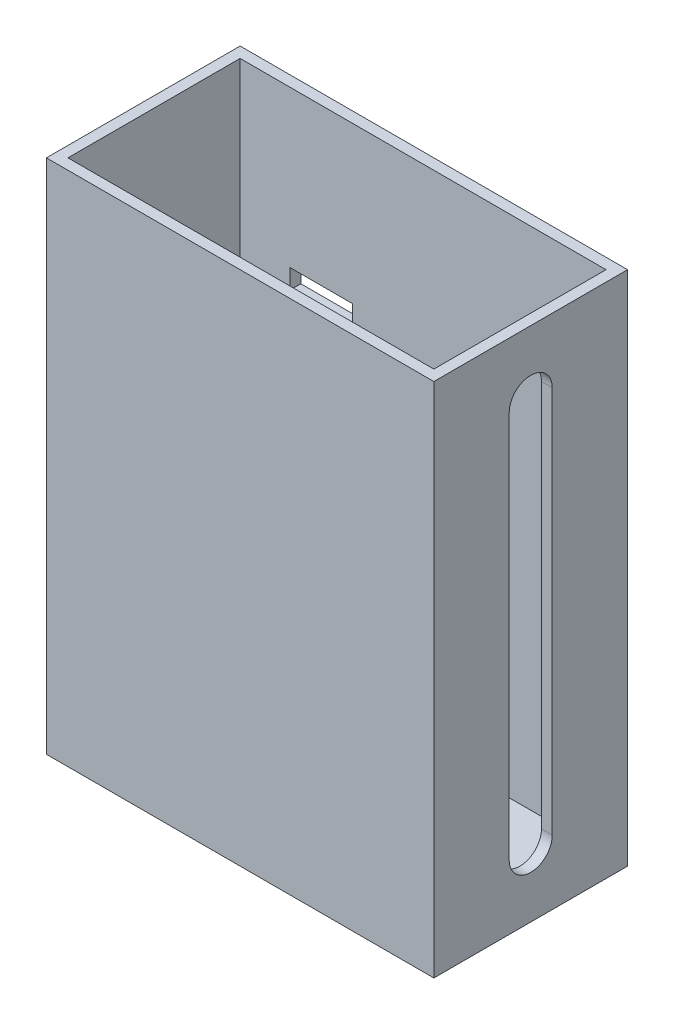
ISO-10303-21;
HEADER;
FILE_DESCRIPTION(('STEP AP214'),'2;1');
FILE_NAME('part.step','',(''),(''),'','','');
FILE_SCHEMA(('AUTOMOTIVE_DESIGN { 1 0 10303 214 1 1 1 1 }'));
ENDSEC;
DATA;
#1=APPLICATION_CONTEXT('core data for automotive mechanical design processes');
#2=APPLICATION_PROTOCOL_DEFINITION('international standard','automotive_design',2000,#1);
#3=PRODUCT_CONTEXT('',#1,'mechanical');
#4=PRODUCT('Part','Part','',(#3));
#5=PRODUCT_RELATED_PRODUCT_CATEGORY('part','',(#4));
#6=PRODUCT_DEFINITION_FORMATION('','',#4);
#7=PRODUCT_DEFINITION_CONTEXT('part definition',#1,'design');
#8=PRODUCT_DEFINITION('design','',#6,#7);
#9=PRODUCT_DEFINITION_SHAPE('','',#8);
#10=(LENGTH_UNIT() NAMED_UNIT(*) SI_UNIT(.MILLI.,.METRE.));
#11=(NAMED_UNIT(*) PLANE_ANGLE_UNIT() SI_UNIT($,.RADIAN.));
#12=(NAMED_UNIT(*) SI_UNIT($,.STERADIAN.) SOLID_ANGLE_UNIT());
#13=UNCERTAINTY_MEASURE_WITH_UNIT(LENGTH_MEASURE(1.E-05),#10,'distance_accuracy_value','');
#14=(GEOMETRIC_REPRESENTATION_CONTEXT(3) GLOBAL_UNCERTAINTY_ASSIGNED_CONTEXT((#13)) GLOBAL_UNIT_ASSIGNED_CONTEXT((#10,
#11,#12)) REPRESENTATION_CONTEXT('',''));
#15=CARTESIAN_POINT('',(0.,0.,0.));
#16=DIRECTION('',(0.,0.,1.));
#17=DIRECTION('',(1.,0.,0.));
#18=AXIS2_PLACEMENT_3D('',#15,#16,#17);
#19=CARTESIAN_POINT('',(228.6,609.6,-114.3));
#20=DIRECTION('',(-1.,0.,0.));
#21=DIRECTION('',(0.,0.,1.));
#22=AXIS2_PLACEMENT_3D('',#19,#20,#21);
#23=PLANE('',#22);
#24=DIRECTION('',(0.,1.,0.));
#25=VECTOR('',#24,1.);
#26=CARTESIAN_POINT('',(228.6,76.2,-25.4));
#27=LINE('',#26,#25);
#28=CARTESIAN_POINT('',(228.6,76.2,-25.4));
#29=VERTEX_POINT('',#28);
#30=CARTESIAN_POINT('',(228.6,533.4,-25.3999999999999));
#31=VERTEX_POINT('',#30);
#32=EDGE_CURVE('E320',#29,#31,#27,.T.);
#33=ORIENTED_EDGE('',*,*,#32,.F.);
#34=CARTESIAN_POINT('',(228.6,76.2,0.));
#35=DIRECTION('',(1.,0.,0.));
#36=DIRECTION('',(0.,0.,-1.));
#37=AXIS2_PLACEMENT_3D('',#34,#35,#36);
#38=CIRCLE('',#37,25.4);
#39=CARTESIAN_POINT('',(228.6,76.2,25.4));
#40=VERTEX_POINT('',#39);
#41=EDGE_CURVE('E323',#40,#29,#38,.T.);
#42=ORIENTED_EDGE('',*,*,#41,.F.);
#43=DIRECTION('',(0.,-1.,0.));
#44=VECTOR('',#43,1.);
#45=CARTESIAN_POINT('',(228.6,76.2,25.4));
#46=LINE('',#45,#44);
#47=CARTESIAN_POINT('',(228.6,533.4,25.4000000000001));
#48=VERTEX_POINT('',#47);
#49=EDGE_CURVE('E313',#48,#40,#46,.T.);
#50=ORIENTED_EDGE('',*,*,#49,.F.);
#51=CARTESIAN_POINT('',(228.6,533.4,0.));
#52=DIRECTION('',(1.,0.,0.));
#53=DIRECTION('',(0.,0.,-1.));
#54=AXIS2_PLACEMENT_3D('',#51,#52,#53);
#55=CIRCLE('',#54,25.4);
#56=EDGE_CURVE('E317',#31,#48,#55,.T.);
#57=ORIENTED_EDGE('',*,*,#56,.F.);
#58=EDGE_LOOP('',(#33,#42,#50,#57));
#59=FACE_BOUND('',#58,.T.);
#60=DIRECTION('',(0.,0.,-1.));
#61=VECTOR('',#60,1.);
#62=CARTESIAN_POINT('',(228.6,0.,-114.3));
#63=LINE('',#62,#61);
#64=CARTESIAN_POINT('',(228.6,0.,114.3));
#65=VERTEX_POINT('',#64);
#66=CARTESIAN_POINT('',(228.6,0.,-114.3));
#67=VERTEX_POINT('',#66);
#68=EDGE_CURVE('E346',#65,#67,#63,.T.);
#69=ORIENTED_EDGE('',*,*,#68,.T.);
#70=DIRECTION('',(0.,-1.,0.));
#71=VECTOR('',#70,1.);
#72=CARTESIAN_POINT('',(228.6,609.6,-114.3));
#73=LINE('',#72,#71);
#74=CARTESIAN_POINT('',(228.6,609.6,-114.3));
#75=VERTEX_POINT('',#74);
#76=EDGE_CURVE('E396',#75,#67,#73,.T.);
#77=ORIENTED_EDGE('',*,*,#76,.F.);
#78=DIRECTION('',(0.,0.,-1.));
#79=VECTOR('',#78,1.);
#80=CARTESIAN_POINT('',(228.6,609.6,-114.3));
#81=LINE('',#80,#79);
#82=CARTESIAN_POINT('',(228.6,609.6,114.3));
#83=VERTEX_POINT('',#82);
#84=EDGE_CURVE('E370',#83,#75,#81,.T.);
#85=ORIENTED_EDGE('',*,*,#84,.F.);
#86=DIRECTION('',(0.,-1.,0.));
#87=VECTOR('',#86,1.);
#88=CARTESIAN_POINT('',(228.6,609.6,114.3));
#89=LINE('',#88,#87);
#90=EDGE_CURVE('E380',#83,#65,#89,.T.);
#91=ORIENTED_EDGE('',*,*,#90,.T.);
#92=EDGE_LOOP('',(#69,#77,#85,#91));
#93=FACE_BOUND('',#92,.T.);
#94=ADVANCED_FACE('F56',(#59,#93),#23,.F.);
#95=CARTESIAN_POINT('',(-228.6,609.6,-114.3));
#96=DIRECTION('',(0.,0.,1.));
#97=DIRECTION('',(1.,0.,0.));
#98=AXIS2_PLACEMENT_3D('',#95,#96,#97);
#99=PLANE('',#98);
#100=DIRECTION('',(-1.,0.,0.));
#101=VECTOR('',#100,1.);
#102=CARTESIAN_POINT('',(0.,300.535372474371,-114.3));
#103=LINE('',#102,#101);
#104=CARTESIAN_POINT('',(-93.5736211502286,300.535372474371,-114.3));
#105=VERTEX_POINT('',#104);
#106=CARTESIAN_POINT('',(-157.073621150229,300.535372474371,-114.3));
#107=VERTEX_POINT('',#106);
#108=EDGE_CURVE('E256',#105,#107,#103,.T.);
#109=ORIENTED_EDGE('',*,*,#108,.F.);
#110=DIRECTION('',(0.,-1.,0.));
#111=VECTOR('',#110,1.);
#112=CARTESIAN_POINT('',(-93.5736211502286,0.,-114.3));
#113=LINE('',#112,#111);
#114=CARTESIAN_POINT('',(-93.5736211502286,369.115372474371,-114.3));
#115=VERTEX_POINT('',#114);
#116=EDGE_CURVE('E260',#115,#105,#113,.T.);
#117=ORIENTED_EDGE('',*,*,#116,.F.);
#118=DIRECTION('',(-1.,0.,0.));
#119=VECTOR('',#118,1.);
#120=CARTESIAN_POINT('',(0.,369.115372474371,-114.3));
#121=LINE('',#120,#119);
#122=CARTESIAN_POINT('',(-157.073621150229,369.115372474371,-114.3));
#123=VERTEX_POINT('',#122);
#124=EDGE_CURVE('E249',#115,#123,#121,.T.);
#125=ORIENTED_EDGE('',*,*,#124,.T.);
#126=DIRECTION('',(0.,-1.,0.));
#127=VECTOR('',#126,1.);
#128=CARTESIAN_POINT('',(-157.073621150229,0.,-114.3));
#129=LINE('',#128,#127);
#130=EDGE_CURVE('E248',#123,#107,#129,.T.);
#131=ORIENTED_EDGE('',*,*,#130,.T.);
#132=EDGE_LOOP('',(#109,#117,#125,#131));
#133=FACE_BOUND('',#132,.T.);
#134=DIRECTION('',(0.,-1.,0.));
#135=VECTOR('',#134,1.);
#136=CARTESIAN_POINT('',(-83.3215847400197,0.,-114.3));
#137=LINE('',#136,#135);
#138=CARTESIAN_POINT('',(-83.3215847400197,425.276963369774,-114.3));
#139=VERTEX_POINT('',#138);
#140=CARTESIAN_POINT('',(-83.3215847400197,402.416963369774,-114.3));
#141=VERTEX_POINT('',#140);
#142=EDGE_CURVE('E297',#139,#141,#137,.T.);
#143=ORIENTED_EDGE('',*,*,#142,.F.);
#144=DIRECTION('',(1.,0.,0.));
#145=VECTOR('',#144,1.);
#146=CARTESIAN_POINT('',(0.,425.276963369774,-114.3));
#147=LINE('',#146,#145);
#148=CARTESIAN_POINT('',(-156.98158474002,425.276963369774,-114.3));
#149=VERTEX_POINT('',#148);
#150=EDGE_CURVE('E282',#149,#139,#147,.T.);
#151=ORIENTED_EDGE('',*,*,#150,.F.);
#152=DIRECTION('',(0.,-1.,0.));
#153=VECTOR('',#152,1.);
#154=CARTESIAN_POINT('',(-156.98158474002,0.,-114.3));
#155=LINE('',#154,#153);
#156=CARTESIAN_POINT('',(-156.98158474002,402.416963369774,-114.3));
#157=VERTEX_POINT('',#156);
#158=EDGE_CURVE('E291',#149,#157,#155,.T.);
#159=ORIENTED_EDGE('',*,*,#158,.T.);
#160=DIRECTION('',(1.,0.,0.));
#161=VECTOR('',#160,1.);
#162=CARTESIAN_POINT('',(0.,402.416963369774,-114.3));
#163=LINE('',#162,#161);
#164=EDGE_CURVE('E294',#157,#141,#163,.T.);
#165=ORIENTED_EDGE('',*,*,#164,.T.);
#166=EDGE_LOOP('',(#143,#151,#159,#165));
#167=FACE_BOUND('',#166,.T.);
#168=DIRECTION('',(-1.,0.,0.));
#169=VECTOR('',#168,1.);
#170=CARTESIAN_POINT('',(-228.6,0.,-114.3));
#171=LINE('',#170,#169);
#172=CARTESIAN_POINT('',(-228.6,0.,-114.3));
#173=VERTEX_POINT('',#172);
#174=EDGE_CURVE('E383',#67,#173,#171,.T.);
#175=ORIENTED_EDGE('',*,*,#174,.T.);
#176=DIRECTION('',(0.,-1.,0.));
#177=VECTOR('',#176,1.);
#178=CARTESIAN_POINT('',(-228.6,609.6,-114.3));
#179=LINE('',#178,#177);
#180=CARTESIAN_POINT('',(-228.6,609.6,-114.3));
#181=VERTEX_POINT('',#180);
#182=EDGE_CURVE('E393',#181,#173,#179,.T.);
#183=ORIENTED_EDGE('',*,*,#182,.F.);
#184=DIRECTION('',(-1.,0.,0.));
#185=VECTOR('',#184,1.);
#186=CARTESIAN_POINT('',(-228.6,609.6,-114.3));
#187=LINE('',#186,#185);
#188=EDGE_CURVE('E373',#75,#181,#187,.T.);
#189=ORIENTED_EDGE('',*,*,#188,.F.);
#190=ORIENTED_EDGE('',*,*,#76,.T.);
#191=EDGE_LOOP('',(#175,#183,#189,#190));
#192=FACE_BOUND('',#191,.T.);
#193=ADVANCED_FACE('F423',(#133,#167,#192),#99,.F.);
#194=CARTESIAN_POINT('',(-228.6,609.6,-114.3));
#195=DIRECTION('',(1.,0.,0.));
#196=DIRECTION('',(0.,0.,-1.));
#197=AXIS2_PLACEMENT_3D('',#194,#195,#196);
#198=PLANE('',#197);
#199=DIRECTION('',(0.,0.,-1.));
#200=VECTOR('',#199,1.);
#201=CARTESIAN_POINT('',(-228.6,30.4659225321989,-65.385211060069));
#202=LINE('',#201,#200);
#203=CARTESIAN_POINT('',(-228.6,30.4659225321989,-65.385211060069));
#204=VERTEX_POINT('',#203);
#205=CARTESIAN_POINT('',(-228.6,30.4659225321989,-88.1132200210403));
#206=VERTEX_POINT('',#205);
#207=EDGE_CURVE('E227',#204,#206,#202,.T.);
#208=ORIENTED_EDGE('',*,*,#207,.F.);
#209=CARTESIAN_POINT('',(-228.6,24.1159225321989,-65.385211060069));
#210=DIRECTION('',(-1.,0.,0.));
#211=DIRECTION('',(0.,0.,1.));
#212=AXIS2_PLACEMENT_3D('',#209,#210,#211);
#213=CIRCLE('',#212,6.35);
#214=CARTESIAN_POINT('',(-228.6,17.7659225321989,-65.385211060069));
#215=VERTEX_POINT('',#214);
#216=EDGE_CURVE('E70',#215,#204,#213,.T.);
#217=ORIENTED_EDGE('',*,*,#216,.F.);
#218=DIRECTION('',(0.,0.,-1.));
#219=VECTOR('',#218,1.);
#220=CARTESIAN_POINT('',(-228.6,17.7659225321989,-65.385211060069));
#221=LINE('',#220,#219);
#222=CARTESIAN_POINT('',(-228.6,17.7659225321989,-88.1132200210403));
#223=VERTEX_POINT('',#222);
#224=EDGE_CURVE('E234',#215,#223,#221,.T.);
#225=ORIENTED_EDGE('',*,*,#224,.T.);
#226=CARTESIAN_POINT('',(-228.6,24.1159225321989,-88.1132200210403));
#227=DIRECTION('',(-1.,0.,0.));
#228=DIRECTION('',(0.,0.,1.));
#229=AXIS2_PLACEMENT_3D('',#226,#227,#228);
#230=CIRCLE('',#229,6.35);
#231=EDGE_CURVE('E218',#206,#223,#230,.T.);
#232=ORIENTED_EDGE('',*,*,#231,.F.);
#233=EDGE_LOOP('',(#208,#217,#225,#232));
#234=FACE_BOUND('',#233,.T.);
#235=DIRECTION('',(0.,0.,1.));
#236=VECTOR('',#235,1.);
#237=CARTESIAN_POINT('',(-228.6,0.,-114.3));
#238=LINE('',#237,#236);
#239=CARTESIAN_POINT('',(-228.6,0.,114.3));
#240=VERTEX_POINT('',#239);
#241=EDGE_CURVE('E385',#173,#240,#238,.T.);
#242=ORIENTED_EDGE('',*,*,#241,.T.);
#243=DIRECTION('',(0.,-1.,0.));
#244=VECTOR('',#243,1.);
#245=CARTESIAN_POINT('',(-228.6,609.6,114.3));
#246=LINE('',#245,#244);
#247=CARTESIAN_POINT('',(-228.6,609.6,114.3));
#248=VERTEX_POINT('',#247);
#249=EDGE_CURVE('E390',#248,#240,#246,.T.);
#250=ORIENTED_EDGE('',*,*,#249,.F.);
#251=DIRECTION('',(0.,0.,1.));
#252=VECTOR('',#251,1.);
#253=CARTESIAN_POINT('',(-228.6,609.6,-114.3));
#254=LINE('',#253,#252);
#255=EDGE_CURVE('E376',#181,#248,#254,.T.);
#256=ORIENTED_EDGE('',*,*,#255,.F.);
#257=ORIENTED_EDGE('',*,*,#182,.T.);
#258=EDGE_LOOP('',(#242,#250,#256,#257));
#259=FACE_BOUND('',#258,.T.);
#260=ADVANCED_FACE('F231',(#234,#259),#198,.F.);
#261=CARTESIAN_POINT('',(-228.6,609.6,114.3));
#262=DIRECTION('',(0.,0.,-1.));
#263=DIRECTION('',(-1.,0.,0.));
#264=AXIS2_PLACEMENT_3D('',#261,#262,#263);
#265=PLANE('',#264);
#266=DIRECTION('',(1.,0.,0.));
#267=VECTOR('',#266,1.);
#268=CARTESIAN_POINT('',(-228.6,0.,114.3));
#269=LINE('',#268,#267);
#270=EDGE_CURVE('E374',#240,#65,#269,.T.);
#271=ORIENTED_EDGE('',*,*,#270,.T.);
#272=ORIENTED_EDGE('',*,*,#90,.F.);
#273=DIRECTION('',(1.,0.,0.));
#274=VECTOR('',#273,1.);
#275=CARTESIAN_POINT('',(-228.6,609.6,114.3));
#276=LINE('',#275,#274);
#277=EDGE_CURVE('E378',#248,#83,#276,.T.);
#278=ORIENTED_EDGE('',*,*,#277,.F.);
#279=ORIENTED_EDGE('',*,*,#249,.T.);
#280=EDGE_LOOP('',(#271,#272,#278,#279));
#281=FACE_BOUND('',#280,.T.);
#282=ADVANCED_FACE('F449',(#281),#265,.F.);
#283=CARTESIAN_POINT('',(0.,609.6,0.));
#284=DIRECTION('',(0.,1.,0.));
#285=DIRECTION('',(0.,0.,1.));
#286=AXIS2_PLACEMENT_3D('',#283,#284,#285);
#287=PLANE('',#286);
#288=DIRECTION('',(0.,0.,-1.));
#289=VECTOR('',#288,1.);
#290=CARTESIAN_POINT('',(215.9,609.6,-114.3));
#291=LINE('',#290,#289);
#292=CARTESIAN_POINT('',(215.9,609.6,101.6));
#293=VERTEX_POINT('',#292);
#294=CARTESIAN_POINT('',(215.9,609.6,-101.6));
#295=VERTEX_POINT('',#294);
#296=EDGE_CURVE('E362',#293,#295,#291,.T.);
#297=ORIENTED_EDGE('',*,*,#296,.F.);
#298=DIRECTION('',(1.,0.,0.));
#299=VECTOR('',#298,1.);
#300=CARTESIAN_POINT('',(-228.6,609.6,101.6));
#301=LINE('',#300,#299);
#302=CARTESIAN_POINT('',(-215.9,609.6,101.6));
#303=VERTEX_POINT('',#302);
#304=EDGE_CURVE('E352',#303,#293,#301,.T.);
#305=ORIENTED_EDGE('',*,*,#304,.F.);
#306=DIRECTION('',(0.,0.,1.));
#307=VECTOR('',#306,1.);
#308=CARTESIAN_POINT('',(-215.9,609.6,-114.3));
#309=LINE('',#308,#307);
#310=CARTESIAN_POINT('',(-215.9,609.6,-101.6));
#311=VERTEX_POINT('',#310);
#312=EDGE_CURVE('E366',#311,#303,#309,.T.);
#313=ORIENTED_EDGE('',*,*,#312,.F.);
#314=DIRECTION('',(-1.,0.,0.));
#315=VECTOR('',#314,1.);
#316=CARTESIAN_POINT('',(-228.6,609.6,-101.6));
#317=LINE('',#316,#315);
#318=EDGE_CURVE('E364',#295,#311,#317,.T.);
#319=ORIENTED_EDGE('',*,*,#318,.F.);
#320=EDGE_LOOP('',(#297,#305,#313,#319));
#321=FACE_BOUND('',#320,.T.);
#322=ORIENTED_EDGE('',*,*,#84,.T.);
#323=ORIENTED_EDGE('',*,*,#188,.T.);
#324=ORIENTED_EDGE('',*,*,#255,.T.);
#325=ORIENTED_EDGE('',*,*,#277,.T.);
#326=EDGE_LOOP('',(#322,#323,#324,#325));
#327=FACE_BOUND('',#326,.T.);
#328=ADVANCED_FACE('F445',(#321,#327),#287,.T.);
#329=CARTESIAN_POINT('',(0.,0.,0.));
#330=DIRECTION('',(0.,1.,0.));
#331=DIRECTION('',(0.,0.,1.));
#332=AXIS2_PLACEMENT_3D('',#329,#330,#331);
#333=PLANE('',#332);
#334=ORIENTED_EDGE('',*,*,#68,.F.);
#335=ORIENTED_EDGE('',*,*,#270,.F.);
#336=ORIENTED_EDGE('',*,*,#241,.F.);
#337=ORIENTED_EDGE('',*,*,#174,.F.);
#338=EDGE_LOOP('',(#334,#335,#336,#337));
#339=FACE_BOUND('',#338,.T.);
#340=ADVANCED_FACE('F439',(#339),#333,.F.);
#341=CARTESIAN_POINT('',(215.9,609.6,-114.3));
#342=DIRECTION('',(-1.,0.,0.));
#343=DIRECTION('',(0.,0.,1.));
#344=AXIS2_PLACEMENT_3D('',#341,#342,#343);
#345=PLANE('',#344);
#346=CARTESIAN_POINT('',(215.9,76.2,0.));
#347=DIRECTION('',(-1.,0.,0.));
#348=DIRECTION('',(0.,0.,1.));
#349=AXIS2_PLACEMENT_3D('',#346,#347,#348);
#350=CIRCLE('',#349,25.4);
#351=CARTESIAN_POINT('',(215.9,76.2,25.4));
#352=VERTEX_POINT('',#351);
#353=CARTESIAN_POINT('',(215.9,76.2,-25.4));
#354=VERTEX_POINT('',#353);
#355=EDGE_CURVE('E271',#352,#354,#350,.F.);
#356=ORIENTED_EDGE('',*,*,#355,.T.);
#357=DIRECTION('',(0.,1.,0.));
#358=VECTOR('',#357,1.);
#359=CARTESIAN_POINT('',(215.9,76.2,-25.4));
#360=LINE('',#359,#358);
#361=CARTESIAN_POINT('',(215.9,533.4,-25.4));
#362=VERTEX_POINT('',#361);
#363=EDGE_CURVE('E308',#354,#362,#360,.T.);
#364=ORIENTED_EDGE('',*,*,#363,.T.);
#365=CARTESIAN_POINT('',(215.9,533.4,0.));
#366=DIRECTION('',(-1.,0.,0.));
#367=DIRECTION('',(0.,0.,1.));
#368=AXIS2_PLACEMENT_3D('',#365,#366,#367);
#369=CIRCLE('',#368,25.4);
#370=CARTESIAN_POINT('',(215.9,533.4,25.4000000000001));
#371=VERTEX_POINT('',#370);
#372=EDGE_CURVE('E332',#362,#371,#369,.F.);
#373=ORIENTED_EDGE('',*,*,#372,.T.);
#374=DIRECTION('',(0.,-1.,0.));
#375=VECTOR('',#374,1.);
#376=CARTESIAN_POINT('',(215.9,76.2,25.4));
#377=LINE('',#376,#375);
#378=EDGE_CURVE('E328',#371,#352,#377,.T.);
#379=ORIENTED_EDGE('',*,*,#378,.T.);
#380=EDGE_LOOP('',(#356,#364,#373,#379));
#381=FACE_BOUND('',#380,.T.);
#382=DIRECTION('',(0.,0.,-1.));
#383=VECTOR('',#382,1.);
#384=CARTESIAN_POINT('',(215.9,12.7,-114.3));
#385=LINE('',#384,#383);
#386=CARTESIAN_POINT('',(215.9,12.7,101.6));
#387=VERTEX_POINT('',#386);
#388=CARTESIAN_POINT('',(215.9,12.7,-101.6));
#389=VERTEX_POINT('',#388);
#390=EDGE_CURVE('E316',#387,#389,#385,.T.);
#391=ORIENTED_EDGE('',*,*,#390,.F.);
#392=DIRECTION('',(0.,-1.,0.));
#393=VECTOR('',#392,1.);
#394=CARTESIAN_POINT('',(215.9,609.6,101.6));
#395=LINE('',#394,#393);
#396=EDGE_CURVE('E348',#293,#387,#395,.T.);
#397=ORIENTED_EDGE('',*,*,#396,.F.);
#398=ORIENTED_EDGE('',*,*,#296,.T.);
#399=DIRECTION('',(0.,-1.,0.));
#400=VECTOR('',#399,1.);
#401=CARTESIAN_POINT('',(215.9,609.6,-101.6));
#402=LINE('',#401,#400);
#403=EDGE_CURVE('E343',#295,#389,#402,.T.);
#404=ORIENTED_EDGE('',*,*,#403,.T.);
#405=EDGE_LOOP('',(#391,#397,#398,#404));
#406=FACE_BOUND('',#405,.T.);
#407=ADVANCED_FACE('F459',(#381,#406),#345,.T.);
#408=CARTESIAN_POINT('',(-228.6,609.6,-101.6));
#409=DIRECTION('',(0.,0.,1.));
#410=DIRECTION('',(1.,0.,0.));
#411=AXIS2_PLACEMENT_3D('',#408,#409,#410);
#412=PLANE('',#411);
#413=DIRECTION('',(0.,-1.,0.));
#414=VECTOR('',#413,1.);
#415=CARTESIAN_POINT('',(-93.5736211502286,0.,-101.6));
#416=LINE('',#415,#414);
#417=CARTESIAN_POINT('',(-93.5736211502286,369.115372474371,-101.6));
#418=VERTEX_POINT('',#417);
#419=CARTESIAN_POINT('',(-93.5736211502286,300.535372474371,-101.6));
#420=VERTEX_POINT('',#419);
#421=EDGE_CURVE('E262',#418,#420,#416,.T.);
#422=ORIENTED_EDGE('',*,*,#421,.T.);
#423=DIRECTION('',(-1.,0.,0.));
#424=VECTOR('',#423,1.);
#425=CARTESIAN_POINT('',(0.,300.535372474371,-101.6));
#426=LINE('',#425,#424);
#427=CARTESIAN_POINT('',(-157.073621150229,300.535372474371,-101.6));
#428=VERTEX_POINT('',#427);
#429=EDGE_CURVE('E244',#420,#428,#426,.T.);
#430=ORIENTED_EDGE('',*,*,#429,.T.);
#431=DIRECTION('',(0.,-1.,0.));
#432=VECTOR('',#431,1.);
#433=CARTESIAN_POINT('',(-157.073621150229,0.,-101.6));
#434=LINE('',#433,#432);
#435=CARTESIAN_POINT('',(-157.073621150229,369.115372474371,-101.6));
#436=VERTEX_POINT('',#435);
#437=EDGE_CURVE('E268',#436,#428,#434,.T.);
#438=ORIENTED_EDGE('',*,*,#437,.F.);
#439=DIRECTION('',(-1.,0.,0.));
#440=VECTOR('',#439,1.);
#441=CARTESIAN_POINT('',(0.,369.115372474371,-101.6));
#442=LINE('',#441,#440);
#443=EDGE_CURVE('E259',#418,#436,#442,.T.);
#444=ORIENTED_EDGE('',*,*,#443,.F.);
#445=EDGE_LOOP('',(#422,#430,#438,#444));
#446=FACE_BOUND('',#445,.T.);
#447=DIRECTION('',(1.,0.,0.));
#448=VECTOR('',#447,1.);
#449=CARTESIAN_POINT('',(0.,425.276963369774,-101.6));
#450=LINE('',#449,#448);
#451=CARTESIAN_POINT('',(-156.98158474002,425.276963369774,-101.6));
#452=VERTEX_POINT('',#451);
#453=CARTESIAN_POINT('',(-83.3215847400197,425.276963369774,-101.6));
#454=VERTEX_POINT('',#453);
#455=EDGE_CURVE('E303',#452,#454,#450,.T.);
#456=ORIENTED_EDGE('',*,*,#455,.T.);
#457=DIRECTION('',(0.,-1.,0.));
#458=VECTOR('',#457,1.);
#459=CARTESIAN_POINT('',(-83.3215847400197,0.,-101.6));
#460=LINE('',#459,#458);
#461=CARTESIAN_POINT('',(-83.3215847400197,402.416963369774,-101.6));
#462=VERTEX_POINT('',#461);
#463=EDGE_CURVE('E300',#454,#462,#460,.T.);
#464=ORIENTED_EDGE('',*,*,#463,.T.);
#465=DIRECTION('',(1.,0.,0.));
#466=VECTOR('',#465,1.);
#467=CARTESIAN_POINT('',(0.,402.416963369774,-101.6));
#468=LINE('',#467,#466);
#469=CARTESIAN_POINT('',(-156.98158474002,402.416963369774,-101.6));
#470=VERTEX_POINT('',#469);
#471=EDGE_CURVE('E241',#470,#462,#468,.T.);
#472=ORIENTED_EDGE('',*,*,#471,.F.);
#473=DIRECTION('',(0.,-1.,0.));
#474=VECTOR('',#473,1.);
#475=CARTESIAN_POINT('',(-156.98158474002,0.,-101.6));
#476=LINE('',#475,#474);
#477=EDGE_CURVE('E266',#452,#470,#476,.T.);
#478=ORIENTED_EDGE('',*,*,#477,.F.);
#479=EDGE_LOOP('',(#456,#464,#472,#478));
#480=FACE_BOUND('',#479,.T.);
#481=DIRECTION('',(-1.,0.,0.));
#482=VECTOR('',#481,1.);
#483=CARTESIAN_POINT('',(-228.6,12.7,-101.6));
#484=LINE('',#483,#482);
#485=CARTESIAN_POINT('',(-215.9,12.7,-101.6));
#486=VERTEX_POINT('',#485);
#487=EDGE_CURVE('E342',#389,#486,#484,.T.);
#488=ORIENTED_EDGE('',*,*,#487,.F.);
#489=ORIENTED_EDGE('',*,*,#403,.F.);
#490=ORIENTED_EDGE('',*,*,#318,.T.);
#491=DIRECTION('',(0.,-1.,0.));
#492=VECTOR('',#491,1.);
#493=CARTESIAN_POINT('',(-215.9,609.6,-101.6));
#494=LINE('',#493,#492);
#495=EDGE_CURVE('E347',#311,#486,#494,.T.);
#496=ORIENTED_EDGE('',*,*,#495,.T.);
#497=EDGE_LOOP('',(#488,#489,#490,#496));
#498=FACE_BOUND('',#497,.T.);
#499=ADVANCED_FACE('F474',(#446,#480,#498),#412,.T.);
#500=CARTESIAN_POINT('',(-215.9,609.6,-114.3));
#501=DIRECTION('',(1.,0.,0.));
#502=DIRECTION('',(0.,0.,-1.));
#503=AXIS2_PLACEMENT_3D('',#500,#501,#502);
#504=PLANE('',#503);
#505=CARTESIAN_POINT('',(-215.9,24.1159225321989,-65.385211060069));
#506=DIRECTION('',(1.,0.,0.));
#507=DIRECTION('',(0.,0.,-1.));
#508=AXIS2_PLACEMENT_3D('',#505,#506,#507);
#509=CIRCLE('',#508,6.35);
#510=CARTESIAN_POINT('',(-215.9,30.4659225321989,-65.385211060069));
#511=VERTEX_POINT('',#510);
#512=CARTESIAN_POINT('',(-215.9,17.7659225321989,-65.385211060069));
#513=VERTEX_POINT('',#512);
#514=EDGE_CURVE('E12',#511,#513,#509,.T.);
#515=ORIENTED_EDGE('',*,*,#514,.F.);
#516=DIRECTION('',(0.,0.,1.));
#517=VECTOR('',#516,1.);
#518=CARTESIAN_POINT('',(-215.9,30.4659225321989,-114.3));
#519=LINE('',#518,#517);
#520=CARTESIAN_POINT('',(-215.9,30.4659225321989,-88.1132200210403));
#521=VERTEX_POINT('',#520);
#522=EDGE_CURVE('E399',#521,#511,#519,.T.);
#523=ORIENTED_EDGE('',*,*,#522,.F.);
#524=CARTESIAN_POINT('',(-215.9,24.1159225321989,-88.1132200210403));
#525=DIRECTION('',(1.,0.,0.));
#526=DIRECTION('',(0.,0.,-1.));
#527=AXIS2_PLACEMENT_3D('',#524,#525,#526);
#528=CIRCLE('',#527,6.35);
#529=CARTESIAN_POINT('',(-215.9,17.7659225321989,-88.1132200210403));
#530=VERTEX_POINT('',#529);
#531=EDGE_CURVE('E221',#530,#521,#528,.T.);
#532=ORIENTED_EDGE('',*,*,#531,.F.);
#533=DIRECTION('',(0.,0.,1.));
#534=VECTOR('',#533,1.);
#535=CARTESIAN_POINT('',(-215.9,17.7659225321989,-114.3));
#536=LINE('',#535,#534);
#537=EDGE_CURVE('E63',#530,#513,#536,.T.);
#538=ORIENTED_EDGE('',*,*,#537,.T.);
#539=EDGE_LOOP('',(#515,#523,#532,#538));
#540=FACE_BOUND('',#539,.T.);
#541=DIRECTION('',(0.,0.,1.));
#542=VECTOR('',#541,1.);
#543=CARTESIAN_POINT('',(-215.9,12.7,-114.3));
#544=LINE('',#543,#542);
#545=CARTESIAN_POINT('',(-215.9,12.7,101.6));
#546=VERTEX_POINT('',#545);
#547=EDGE_CURVE('E354',#486,#546,#544,.T.);
#548=ORIENTED_EDGE('',*,*,#547,.F.);
#549=ORIENTED_EDGE('',*,*,#495,.F.);
#550=ORIENTED_EDGE('',*,*,#312,.T.);
#551=DIRECTION('',(0.,-1.,0.));
#552=VECTOR('',#551,1.);
#553=CARTESIAN_POINT('',(-215.9,609.6,101.6));
#554=LINE('',#553,#552);
#555=EDGE_CURVE('E351',#303,#546,#554,.T.);
#556=ORIENTED_EDGE('',*,*,#555,.T.);
#557=EDGE_LOOP('',(#548,#549,#550,#556));
#558=FACE_BOUND('',#557,.T.);
#559=ADVANCED_FACE('F404',(#540,#558),#504,.T.);
#560=CARTESIAN_POINT('',(-228.6,609.6,101.6));
#561=DIRECTION('',(0.,0.,-1.));
#562=DIRECTION('',(-1.,0.,0.));
#563=AXIS2_PLACEMENT_3D('',#560,#561,#562);
#564=PLANE('',#563);
#565=DIRECTION('',(1.,0.,0.));
#566=VECTOR('',#565,1.);
#567=CARTESIAN_POINT('',(-228.6,12.7,101.6));
#568=LINE('',#567,#566);
#569=EDGE_CURVE('E358',#546,#387,#568,.T.);
#570=ORIENTED_EDGE('',*,*,#569,.F.);
#571=ORIENTED_EDGE('',*,*,#555,.F.);
#572=ORIENTED_EDGE('',*,*,#304,.T.);
#573=ORIENTED_EDGE('',*,*,#396,.T.);
#574=EDGE_LOOP('',(#570,#571,#572,#573));
#575=FACE_BOUND('',#574,.T.);
#576=ADVANCED_FACE('F467',(#575),#564,.T.);
#577=CARTESIAN_POINT('',(0.,12.7,0.));
#578=DIRECTION('',(0.,1.,0.));
#579=DIRECTION('',(0.,0.,1.));
#580=AXIS2_PLACEMENT_3D('',#577,#578,#579);
#581=PLANE('',#580);
#582=ORIENTED_EDGE('',*,*,#390,.T.);
#583=ORIENTED_EDGE('',*,*,#487,.T.);
#584=ORIENTED_EDGE('',*,*,#547,.T.);
#585=ORIENTED_EDGE('',*,*,#569,.T.);
#586=EDGE_LOOP('',(#582,#583,#584,#585));
#587=FACE_BOUND('',#586,.T.);
#588=ADVANCED_FACE('F463',(#587),#581,.T.);
#589=CARTESIAN_POINT('',(-228.601,76.2,0.));
#590=DIRECTION('',(1.,0.,0.));
#591=DIRECTION('',(0.,0.,-1.));
#592=AXIS2_PLACEMENT_3D('',#589,#590,#591);
#593=CYLINDRICAL_SURFACE('',#592,25.4);
#594=DIRECTION('',(1.,0.,0.));
#595=VECTOR('',#594,1.);
#596=CARTESIAN_POINT('',(-228.601,76.2,25.4));
#597=LINE('',#596,#595);
#598=EDGE_CURVE('E331',#352,#40,#597,.T.);
#599=ORIENTED_EDGE('',*,*,#598,.T.);
#600=ORIENTED_EDGE('',*,*,#41,.T.);
#601=DIRECTION('',(1.,0.,0.));
#602=VECTOR('',#601,1.);
#603=CARTESIAN_POINT('',(-228.601,76.2,-25.4));
#604=LINE('',#603,#602);
#605=EDGE_CURVE('E327',#354,#29,#604,.T.);
#606=ORIENTED_EDGE('',*,*,#605,.F.);
#607=ORIENTED_EDGE('',*,*,#355,.F.);
#608=EDGE_LOOP('',(#599,#600,#606,#607));
#609=FACE_BOUND('',#608,.T.);
#610=ADVANCED_FACE('F466',(#609),#593,.F.);
#611=CARTESIAN_POINT('',(-228.601,76.2,25.4));
#612=DIRECTION('',(0.,0.,1.));
#613=DIRECTION('',(0.,-1.,0.));
#614=AXIS2_PLACEMENT_3D('',#611,#612,#613);
#615=PLANE('',#614);
#616=DIRECTION('',(1.,0.,0.));
#617=VECTOR('',#616,1.);
#618=CARTESIAN_POINT('',(-228.601,533.4,25.4000000000001));
#619=LINE('',#618,#617);
#620=EDGE_CURVE('E312',#371,#48,#619,.T.);
#621=ORIENTED_EDGE('',*,*,#620,.T.);
#622=ORIENTED_EDGE('',*,*,#49,.T.);
#623=ORIENTED_EDGE('',*,*,#598,.F.);
#624=ORIENTED_EDGE('',*,*,#378,.F.);
#625=EDGE_LOOP('',(#621,#622,#623,#624));
#626=FACE_BOUND('',#625,.T.);
#627=ADVANCED_FACE('F483',(#626),#615,.F.);
#628=CARTESIAN_POINT('',(-228.601,533.4,1.11741974516621E-13));
#629=DIRECTION('',(1.,0.,0.));
#630=DIRECTION('',(0.,0.,-1.));
#631=AXIS2_PLACEMENT_3D('',#628,#629,#630);
#632=CYLINDRICAL_SURFACE('',#631,25.4);
#633=DIRECTION('',(1.,0.,0.));
#634=VECTOR('',#633,1.);
#635=CARTESIAN_POINT('',(-228.601,533.4,-25.3999999999999));
#636=LINE('',#635,#634);
#637=EDGE_CURVE('E311',#362,#31,#636,.T.);
#638=ORIENTED_EDGE('',*,*,#637,.T.);
#639=ORIENTED_EDGE('',*,*,#56,.T.);
#640=ORIENTED_EDGE('',*,*,#620,.F.);
#641=ORIENTED_EDGE('',*,*,#372,.F.);
#642=EDGE_LOOP('',(#638,#639,#640,#641));
#643=FACE_BOUND('',#642,.T.);
#644=ADVANCED_FACE('F487',(#643),#632,.F.);
#645=CARTESIAN_POINT('',(-228.601,76.2,-25.4));
#646=DIRECTION('',(0.,0.,-1.));
#647=DIRECTION('',(0.,1.,0.));
#648=AXIS2_PLACEMENT_3D('',#645,#646,#647);
#649=PLANE('',#648);
#650=ORIENTED_EDGE('',*,*,#605,.T.);
#651=ORIENTED_EDGE('',*,*,#32,.T.);
#652=ORIENTED_EDGE('',*,*,#637,.F.);
#653=ORIENTED_EDGE('',*,*,#363,.F.);
#654=EDGE_LOOP('',(#650,#651,#652,#653));
#655=FACE_BOUND('',#654,.T.);
#656=ADVANCED_FACE('F491',(#655),#649,.F.);
#657=CARTESIAN_POINT('',(0.,425.276963369774,114.301));
#658=DIRECTION('',(0.,1.,0.));
#659=DIRECTION('',(0.,0.,1.));
#660=AXIS2_PLACEMENT_3D('',#657,#658,#659);
#661=PLANE('',#660);
#662=DIRECTION('',(0.,0.,-1.));
#663=VECTOR('',#662,1.);
#664=CARTESIAN_POINT('',(-156.98158474002,425.276963369774,114.301));
#665=LINE('',#664,#663);
#666=EDGE_CURVE('E286',#452,#149,#665,.T.);
#667=ORIENTED_EDGE('',*,*,#666,.T.);
#668=ORIENTED_EDGE('',*,*,#150,.T.);
#669=DIRECTION('',(0.,0.,-1.));
#670=VECTOR('',#669,1.);
#671=CARTESIAN_POINT('',(-83.3215847400197,425.276963369774,114.301));
#672=LINE('',#671,#670);
#673=EDGE_CURVE('E279',#454,#139,#672,.T.);
#674=ORIENTED_EDGE('',*,*,#673,.F.);
#675=ORIENTED_EDGE('',*,*,#455,.F.);
#676=EDGE_LOOP('',(#667,#668,#674,#675));
#677=FACE_BOUND('',#676,.T.);
#678=ADVANCED_FACE('F495',(#677),#661,.F.);
#679=CARTESIAN_POINT('',(-83.3215847400197,0.,114.301));
#680=DIRECTION('',(1.,0.,0.));
#681=DIRECTION('',(0.,0.,-1.));
#682=AXIS2_PLACEMENT_3D('',#679,#680,#681);
#683=PLANE('',#682);
#684=ORIENTED_EDGE('',*,*,#673,.T.);
#685=ORIENTED_EDGE('',*,*,#142,.T.);
#686=DIRECTION('',(0.,0.,-1.));
#687=VECTOR('',#686,1.);
#688=CARTESIAN_POINT('',(-83.3215847400197,402.416963369774,114.301));
#689=LINE('',#688,#687);
#690=EDGE_CURVE('E280',#462,#141,#689,.T.);
#691=ORIENTED_EDGE('',*,*,#690,.F.);
#692=ORIENTED_EDGE('',*,*,#463,.F.);
#693=EDGE_LOOP('',(#684,#685,#691,#692));
#694=FACE_BOUND('',#693,.T.);
#695=ADVANCED_FACE('F499',(#694),#683,.F.);
#696=CARTESIAN_POINT('',(0.,402.416963369774,114.301));
#697=DIRECTION('',(0.,1.,0.));
#698=DIRECTION('',(0.,0.,1.));
#699=AXIS2_PLACEMENT_3D('',#696,#697,#698);
#700=PLANE('',#699);
#701=ORIENTED_EDGE('',*,*,#471,.T.);
#702=ORIENTED_EDGE('',*,*,#690,.T.);
#703=ORIENTED_EDGE('',*,*,#164,.F.);
#704=DIRECTION('',(0.,0.,-1.));
#705=VECTOR('',#704,1.);
#706=CARTESIAN_POINT('',(-156.98158474002,402.416963369774,114.301));
#707=LINE('',#706,#705);
#708=EDGE_CURVE('E283',#470,#157,#707,.T.);
#709=ORIENTED_EDGE('',*,*,#708,.F.);
#710=EDGE_LOOP('',(#701,#702,#703,#709));
#711=FACE_BOUND('',#710,.T.);
#712=ADVANCED_FACE('F505',(#711),#700,.T.);
#713=CARTESIAN_POINT('',(-156.98158474002,0.,114.301));
#714=DIRECTION('',(1.,0.,0.));
#715=DIRECTION('',(0.,0.,-1.));
#716=AXIS2_PLACEMENT_3D('',#713,#714,#715);
#717=PLANE('',#716);
#718=ORIENTED_EDGE('',*,*,#477,.T.);
#719=ORIENTED_EDGE('',*,*,#708,.T.);
#720=ORIENTED_EDGE('',*,*,#158,.F.);
#721=ORIENTED_EDGE('',*,*,#666,.F.);
#722=EDGE_LOOP('',(#718,#719,#720,#721));
#723=FACE_BOUND('',#722,.T.);
#724=ADVANCED_FACE('F501',(#723),#717,.T.);
#725=CARTESIAN_POINT('',(-93.5736211502286,0.,114.301));
#726=DIRECTION('',(1.,0.,0.));
#727=DIRECTION('',(0.,0.,-1.));
#728=AXIS2_PLACEMENT_3D('',#725,#726,#727);
#729=PLANE('',#728);
#730=DIRECTION('',(0.,0.,-1.));
#731=VECTOR('',#730,1.);
#732=CARTESIAN_POINT('',(-93.5736211502286,369.115372474371,114.301));
#733=LINE('',#732,#731);
#734=EDGE_CURVE('E253',#418,#115,#733,.T.);
#735=ORIENTED_EDGE('',*,*,#734,.T.);
#736=ORIENTED_EDGE('',*,*,#116,.T.);
#737=DIRECTION('',(0.,0.,-1.));
#738=VECTOR('',#737,1.);
#739=CARTESIAN_POINT('',(-93.5736211502286,300.535372474371,114.301));
#740=LINE('',#739,#738);
#741=EDGE_CURVE('E265',#420,#105,#740,.T.);
#742=ORIENTED_EDGE('',*,*,#741,.F.);
#743=ORIENTED_EDGE('',*,*,#421,.F.);
#744=EDGE_LOOP('',(#735,#736,#742,#743));
#745=FACE_BOUND('',#744,.T.);
#746=ADVANCED_FACE('F504',(#745),#729,.F.);
#747=CARTESIAN_POINT('',(0.,369.115372474371,114.301));
#748=DIRECTION('',(0.,-1.,0.));
#749=DIRECTION('',(0.,0.,-1.));
#750=AXIS2_PLACEMENT_3D('',#747,#748,#749);
#751=PLANE('',#750);
#752=ORIENTED_EDGE('',*,*,#443,.T.);
#753=DIRECTION('',(0.,0.,-1.));
#754=VECTOR('',#753,1.);
#755=CARTESIAN_POINT('',(-157.073621150229,369.115372474371,114.301));
#756=LINE('',#755,#754);
#757=EDGE_CURVE('E252',#436,#123,#756,.T.);
#758=ORIENTED_EDGE('',*,*,#757,.T.);
#759=ORIENTED_EDGE('',*,*,#124,.F.);
#760=ORIENTED_EDGE('',*,*,#734,.F.);
#761=EDGE_LOOP('',(#752,#758,#759,#760));
#762=FACE_BOUND('',#761,.T.);
#763=ADVANCED_FACE('F515',(#762),#751,.T.);
#764=CARTESIAN_POINT('',(-157.073621150229,0.,114.301));
#765=DIRECTION('',(1.,0.,0.));
#766=DIRECTION('',(0.,0.,-1.));
#767=AXIS2_PLACEMENT_3D('',#764,#765,#766);
#768=PLANE('',#767);
#769=ORIENTED_EDGE('',*,*,#437,.T.);
#770=DIRECTION('',(0.,0.,-1.));
#771=VECTOR('',#770,1.);
#772=CARTESIAN_POINT('',(-157.073621150229,300.535372474371,114.301));
#773=LINE('',#772,#771);
#774=EDGE_CURVE('E247',#428,#107,#773,.T.);
#775=ORIENTED_EDGE('',*,*,#774,.T.);
#776=ORIENTED_EDGE('',*,*,#130,.F.);
#777=ORIENTED_EDGE('',*,*,#757,.F.);
#778=EDGE_LOOP('',(#769,#775,#776,#777));
#779=FACE_BOUND('',#778,.T.);
#780=ADVANCED_FACE('F418',(#779),#768,.T.);
#781=CARTESIAN_POINT('',(0.,300.535372474371,114.301));
#782=DIRECTION('',(0.,-1.,0.));
#783=DIRECTION('',(0.,0.,-1.));
#784=AXIS2_PLACEMENT_3D('',#781,#782,#783);
#785=PLANE('',#784);
#786=ORIENTED_EDGE('',*,*,#741,.T.);
#787=ORIENTED_EDGE('',*,*,#108,.T.);
#788=ORIENTED_EDGE('',*,*,#774,.F.);
#789=ORIENTED_EDGE('',*,*,#429,.F.);
#790=EDGE_LOOP('',(#786,#787,#788,#789));
#791=FACE_BOUND('',#790,.T.);
#792=ADVANCED_FACE('F411',(#791),#785,.F.);
#793=CARTESIAN_POINT('',(-172.72,24.1159225321989,-65.385211060069));
#794=DIRECTION('',(-1.,0.,0.));
#795=DIRECTION('',(0.,0.,1.));
#796=AXIS2_PLACEMENT_3D('',#793,#794,#795);
#797=CYLINDRICAL_SURFACE('',#796,6.35);
#798=ORIENTED_EDGE('',*,*,#514,.T.);
#799=DIRECTION('',(-1.,0.,0.));
#800=VECTOR('',#799,1.);
#801=CARTESIAN_POINT('',(-172.72,17.7659225321989,-65.385211060069));
#802=LINE('',#801,#800);
#803=EDGE_CURVE('E239',#513,#215,#802,.T.);
#804=ORIENTED_EDGE('',*,*,#803,.T.);
#805=ORIENTED_EDGE('',*,*,#216,.T.);
#806=DIRECTION('',(-1.,0.,0.));
#807=VECTOR('',#806,1.);
#808=CARTESIAN_POINT('',(-172.72,30.4659225321989,-65.385211060069));
#809=LINE('',#808,#807);
#810=EDGE_CURVE('E224',#511,#204,#809,.T.);
#811=ORIENTED_EDGE('',*,*,#810,.F.);
#812=EDGE_LOOP('',(#798,#804,#805,#811));
#813=FACE_BOUND('',#812,.T.);
#814=ADVANCED_FACE('F409',(#813),#797,.F.);
#815=CARTESIAN_POINT('',(-172.72,17.7659225321989,-65.385211060069));
#816=DIRECTION('',(0.,1.,0.));
#817=DIRECTION('',(0.,0.,1.));
#818=AXIS2_PLACEMENT_3D('',#815,#816,#817);
#819=PLANE('',#818);
#820=DIRECTION('',(-1.,0.,0.));
#821=VECTOR('',#820,1.);
#822=CARTESIAN_POINT('',(-172.72,17.7659225321989,-88.1132200210403));
#823=LINE('',#822,#821);
#824=EDGE_CURVE('E223',#530,#223,#823,.T.);
#825=ORIENTED_EDGE('',*,*,#824,.T.);
#826=ORIENTED_EDGE('',*,*,#224,.F.);
#827=ORIENTED_EDGE('',*,*,#803,.F.);
#828=ORIENTED_EDGE('',*,*,#537,.F.);
#829=EDGE_LOOP('',(#825,#826,#827,#828));
#830=FACE_BOUND('',#829,.T.);
#831=ADVANCED_FACE('F408',(#830),#819,.T.);
#832=CARTESIAN_POINT('',(-172.72,24.1159225321989,-88.1132200210403));
#833=DIRECTION('',(-1.,0.,0.));
#834=DIRECTION('',(0.,0.,1.));
#835=AXIS2_PLACEMENT_3D('',#832,#833,#834);
#836=CYLINDRICAL_SURFACE('',#835,6.35);
#837=ORIENTED_EDGE('',*,*,#531,.T.);
#838=DIRECTION('',(-1.,0.,0.));
#839=VECTOR('',#838,1.);
#840=CARTESIAN_POINT('',(-172.72,30.4659225321989,-88.1132200210403));
#841=LINE('',#840,#839);
#842=EDGE_CURVE('E78',#521,#206,#841,.T.);
#843=ORIENTED_EDGE('',*,*,#842,.T.);
#844=ORIENTED_EDGE('',*,*,#231,.T.);
#845=ORIENTED_EDGE('',*,*,#824,.F.);
#846=EDGE_LOOP('',(#837,#843,#844,#845));
#847=FACE_BOUND('',#846,.T.);
#848=ADVANCED_FACE('F215',(#847),#836,.F.);
#849=CARTESIAN_POINT('',(-172.72,30.4659225321989,-65.385211060069));
#850=DIRECTION('',(0.,1.,0.));
#851=DIRECTION('',(0.,0.,1.));
#852=AXIS2_PLACEMENT_3D('',#849,#850,#851);
#853=PLANE('',#852);
#854=ORIENTED_EDGE('',*,*,#522,.T.);
#855=ORIENTED_EDGE('',*,*,#810,.T.);
#856=ORIENTED_EDGE('',*,*,#207,.T.);
#857=ORIENTED_EDGE('',*,*,#842,.F.);
#858=EDGE_LOOP('',(#854,#855,#856,#857));
#859=FACE_BOUND('',#858,.T.);
#860=ADVANCED_FACE('F228',(#859),#853,.F.);
#861=CLOSED_SHELL('',(#94,#193,#260,#282,#328,#340,#407,#499,#559,#576,#588,#610,#627,#644,#656,
#678,#695,#712,#724,#746,#763,#780,#792,#814,#831,#848,#860));
#862=MANIFOLD_SOLID_BREP('B2',#861);
#863=ADVANCED_BREP_SHAPE_REPRESENTATION('',(#18,#862),#14);
#864=SHAPE_DEFINITION_REPRESENTATION(#9,#863);
ENDSEC;
END-ISO-10303-21;
